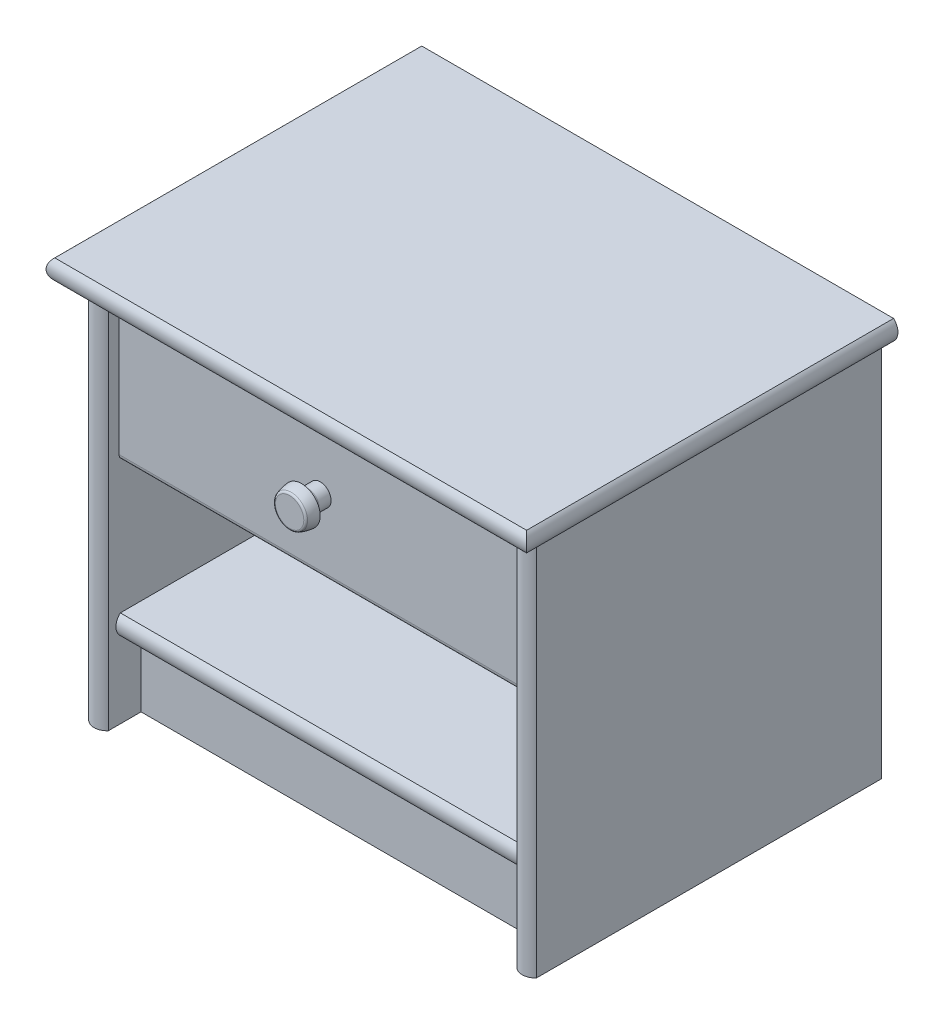
ISO-10303-21;
HEADER;
FILE_DESCRIPTION(('STEP AP214'),'2;1');
FILE_NAME('part.step','',(''),(''),'','','');
FILE_SCHEMA(('AUTOMOTIVE_DESIGN { 1 0 10303 214 1 1 1 1 }'));
ENDSEC;
DATA;
#1=APPLICATION_CONTEXT('core data for automotive mechanical design processes');
#2=APPLICATION_PROTOCOL_DEFINITION('international standard','automotive_design',2000,#1);
#3=PRODUCT_CONTEXT('',#1,'mechanical');
#4=PRODUCT('Part','Part','',(#3));
#5=PRODUCT_RELATED_PRODUCT_CATEGORY('part','',(#4));
#6=PRODUCT_DEFINITION_FORMATION('','',#4);
#7=PRODUCT_DEFINITION_CONTEXT('part definition',#1,'design');
#8=PRODUCT_DEFINITION('design','',#6,#7);
#9=PRODUCT_DEFINITION_SHAPE('','',#8);
#10=(LENGTH_UNIT() NAMED_UNIT(*) SI_UNIT(.MILLI.,.METRE.));
#11=(NAMED_UNIT(*) PLANE_ANGLE_UNIT() SI_UNIT($,.RADIAN.));
#12=(NAMED_UNIT(*) SI_UNIT($,.STERADIAN.) SOLID_ANGLE_UNIT());
#13=UNCERTAINTY_MEASURE_WITH_UNIT(LENGTH_MEASURE(1.E-05),#10,'distance_accuracy_value','');
#14=(GEOMETRIC_REPRESENTATION_CONTEXT(3) GLOBAL_UNCERTAINTY_ASSIGNED_CONTEXT((#13)) GLOBAL_UNIT_ASSIGNED_CONTEXT((#10,
#11,#12)) REPRESENTATION_CONTEXT('',''));
#15=CARTESIAN_POINT('',(0.,0.,0.));
#16=DIRECTION('',(0.,0.,1.));
#17=DIRECTION('',(1.,0.,0.));
#18=AXIS2_PLACEMENT_3D('',#15,#16,#17);
#19=CARTESIAN_POINT('',(187.,176.25,151.));
#20=DIRECTION('',(0.,0.,-1.));
#21=DIRECTION('',(-1.,0.,0.));
#22=AXIS2_PLACEMENT_3D('',#19,#20,#21);
#23=PLANE('',#22);
#24=DIRECTION('',(-1.,0.,0.));
#25=VECTOR('',#24,1.);
#26=CARTESIAN_POINT('',(509.063658303759,40.75,151.000000000003));
#27=LINE('',#26,#25);
#28=CARTESIAN_POINT('',(184.,40.75,151.));
#29=VERTEX_POINT('',#28);
#30=CARTESIAN_POINT('',(-184.,40.75,151.));
#31=VERTEX_POINT('',#30);
#32=EDGE_CURVE('E416',#29,#31,#27,.T.);
#33=ORIENTED_EDGE('',*,*,#32,.F.);
#34=DIRECTION('',(0.,1.,0.));
#35=VECTOR('',#34,1.);
#36=CARTESIAN_POINT('',(184.,27.2631670194948,151.));
#37=LINE('',#36,#35);
#38=CARTESIAN_POINT('',(184.,169.25,151.));
#39=VERTEX_POINT('',#38);
#40=EDGE_CURVE('E360',#29,#39,#37,.T.);
#41=ORIENTED_EDGE('',*,*,#40,.T.);
#42=DIRECTION('',(-1.,0.,0.));
#43=VECTOR('',#42,1.);
#44=CARTESIAN_POINT('',(509.063658303759,169.25,151.000000000003));
#45=LINE('',#44,#43);
#46=CARTESIAN_POINT('',(-184.,169.25,151.));
#47=VERTEX_POINT('',#46);
#48=EDGE_CURVE('E339',#39,#47,#45,.T.);
#49=ORIENTED_EDGE('',*,*,#48,.T.);
#50=DIRECTION('',(0.,1.,0.));
#51=VECTOR('',#50,1.);
#52=CARTESIAN_POINT('',(-184.,27.2631670194948,151.));
#53=LINE('',#52,#51);
#54=EDGE_CURVE('E337',#31,#47,#53,.T.);
#55=ORIENTED_EDGE('',*,*,#54,.F.);
#56=EDGE_LOOP('',(#33,#41,#49,#55));
#57=FACE_BOUND('',#56,.T.);
#58=CARTESIAN_POINT('',(0.,101.25,151.));
#59=DIRECTION('',(0.,0.,-1.));
#60=DIRECTION('',(-1.,0.,0.));
#61=AXIS2_PLACEMENT_3D('',#58,#59,#60);
#62=CIRCLE('',#61,9.99999999999999);
#63=CARTESIAN_POINT('',(-9.99999999999999,101.25,151.));
#64=VERTEX_POINT('',#63);
#65=EDGE_CURVE('E12',#64,#64,#62,.F.);
#66=ORIENTED_EDGE('',*,*,#65,.F.);
#67=EDGE_LOOP('',(#66));
#68=FACE_BOUND('',#67,.T.);
#69=ADVANCED_FACE('F65',(#57,#68),#23,.F.);
#70=CARTESIAN_POINT('',(-205.,176.25,-158.));
#71=DIRECTION('',(0.,0.,1.));
#72=DIRECTION('',(1.,0.,0.));
#73=AXIS2_PLACEMENT_3D('',#70,#71,#72);
#74=PLANE('',#73);
#75=DIRECTION('',(-1.,0.,0.));
#76=VECTOR('',#75,1.);
#77=CARTESIAN_POINT('',(220.,194.25,-158.));
#78=LINE('',#77,#76);
#79=CARTESIAN_POINT('',(216.,194.25,-158.));
#80=VERTEX_POINT('',#79);
#81=CARTESIAN_POINT('',(-216.,194.25,-158.));
#82=VERTEX_POINT('',#81);
#83=EDGE_CURVE('E231',#80,#82,#78,.T.);
#84=ORIENTED_EDGE('',*,*,#83,.F.);
#85=CARTESIAN_POINT('',(207.875,185.25,-158.));
#86=DIRECTION('',(0.,0.,1.));
#87=DIRECTION('',(1.,0.,0.));
#88=AXIS2_PLACEMENT_3D('',#85,#86,#87);
#89=CIRCLE('',#88,12.1249999999999);
#90=CARTESIAN_POINT('',(216.,176.25,-158.));
#91=VERTEX_POINT('',#90);
#92=EDGE_CURVE('E217',#80,#91,#89,.F.);
#93=ORIENTED_EDGE('',*,*,#92,.T.);
#94=DIRECTION('',(-1.,0.,0.));
#95=VECTOR('',#94,1.);
#96=CARTESIAN_POINT('',(220.,176.25,-158.));
#97=LINE('',#96,#95);
#98=CARTESIAN_POINT('',(205.,176.25,-158.));
#99=VERTEX_POINT('',#98);
#100=EDGE_CURVE('E250',#91,#99,#97,.T.);
#101=ORIENTED_EDGE('',*,*,#100,.T.);
#102=DIRECTION('',(0.,-1.,0.));
#103=VECTOR('',#102,1.);
#104=CARTESIAN_POINT('',(205.,176.25,-158.));
#105=LINE('',#104,#103);
#106=CARTESIAN_POINT('',(205.,-176.25,-158.));
#107=VERTEX_POINT('',#106);
#108=EDGE_CURVE('E294',#99,#107,#105,.T.);
#109=ORIENTED_EDGE('',*,*,#108,.T.);
#110=DIRECTION('',(-1.,0.,0.));
#111=VECTOR('',#110,1.);
#112=CARTESIAN_POINT('',(-205.,-176.25,-158.));
#113=LINE('',#112,#111);
#114=CARTESIAN_POINT('',(-205.,-176.25,-158.));
#115=VERTEX_POINT('',#114);
#116=EDGE_CURVE('E80',#107,#115,#113,.T.);
#117=ORIENTED_EDGE('',*,*,#116,.T.);
#118=DIRECTION('',(0.,-1.,0.));
#119=VECTOR('',#118,1.);
#120=CARTESIAN_POINT('',(-205.,176.25,-158.));
#121=LINE('',#120,#119);
#122=CARTESIAN_POINT('',(-205.,176.25,-158.));
#123=VERTEX_POINT('',#122);
#124=EDGE_CURVE('E502',#123,#115,#121,.T.);
#125=ORIENTED_EDGE('',*,*,#124,.F.);
#126=CARTESIAN_POINT('',(-216.,176.25,-158.));
#127=VERTEX_POINT('',#126);
#128=EDGE_CURVE('E248',#123,#127,#97,.T.);
#129=ORIENTED_EDGE('',*,*,#128,.T.);
#130=CARTESIAN_POINT('',(-207.875,185.25,-158.));
#131=DIRECTION('',(0.,0.,1.));
#132=DIRECTION('',(1.,0.,0.));
#133=AXIS2_PLACEMENT_3D('',#130,#131,#132);
#134=CIRCLE('',#133,12.1249999999999);
#135=EDGE_CURVE('E237',#82,#127,#134,.T.);
#136=ORIENTED_EDGE('',*,*,#135,.F.);
#137=EDGE_LOOP('',(#84,#93,#101,#109,#117,#125,#129,#136));
#138=FACE_BOUND('',#137,.T.);
#139=ADVANCED_FACE('F235',(#138),#74,.F.);
#140=CARTESIAN_POINT('',(220.,185.25,169.875));
#141=DIRECTION('',(-1.,0.,0.));
#142=DIRECTION('',(0.,0.,1.));
#143=AXIS2_PLACEMENT_3D('',#140,#141,#142);
#144=CYLINDRICAL_SURFACE('',#143,12.1249999999999);
#145=CARTESIAN_POINT('',(207.875,185.25,169.875));
#146=DIRECTION('',(-0.707106781186547,0.,0.707106781186547));
#147=DIRECTION('',(-0.707106781186547,0.,-0.707106781186547));
#148=AXIS2_PLACEMENT_3D('',#145,#146,#147);
#149=ELLIPSE('',#148,17.1473394437737,12.1249999999999);
#150=CARTESIAN_POINT('',(216.,176.25,178.));
#151=VERTEX_POINT('',#150);
#152=CARTESIAN_POINT('',(216.,194.25,178.));
#153=VERTEX_POINT('',#152);
#154=EDGE_CURVE('E226',#151,#153,#149,.T.);
#155=ORIENTED_EDGE('',*,*,#154,.T.);
#156=DIRECTION('',(-1.,0.,0.));
#157=VECTOR('',#156,1.);
#158=CARTESIAN_POINT('',(220.,194.25,178.));
#159=LINE('',#158,#157);
#160=CARTESIAN_POINT('',(-216.,194.25,178.));
#161=VERTEX_POINT('',#160);
#162=EDGE_CURVE('E233',#153,#161,#159,.T.);
#163=ORIENTED_EDGE('',*,*,#162,.T.);
#164=CARTESIAN_POINT('',(-207.875,185.25,169.875));
#165=DIRECTION('',(-0.707106781186547,0.,-0.707106781186547));
#166=DIRECTION('',(-0.707106781186547,0.,0.707106781186547));
#167=AXIS2_PLACEMENT_3D('',#164,#165,#166);
#168=ELLIPSE('',#167,17.1473394437737,12.1249999999999);
#169=CARTESIAN_POINT('',(-216.,176.25,178.));
#170=VERTEX_POINT('',#169);
#171=EDGE_CURVE('E523',#170,#161,#168,.T.);
#172=ORIENTED_EDGE('',*,*,#171,.F.);
#173=DIRECTION('',(-1.,0.,0.));
#174=VECTOR('',#173,1.);
#175=CARTESIAN_POINT('',(220.,176.25,178.));
#176=LINE('',#175,#174);
#177=EDGE_CURVE('E244',#151,#170,#176,.T.);
#178=ORIENTED_EDGE('',*,*,#177,.F.);
#179=EDGE_LOOP('',(#155,#163,#172,#178));
#180=FACE_BOUND('',#179,.T.);
#181=ADVANCED_FACE('F488',(#180),#144,.T.);
#182=CARTESIAN_POINT('',(220.,194.25,-158.));
#183=DIRECTION('',(0.,-1.,0.));
#184=DIRECTION('',(0.,0.,-1.));
#185=AXIS2_PLACEMENT_3D('',#182,#183,#184);
#186=PLANE('',#185);
#187=ORIENTED_EDGE('',*,*,#162,.F.);
#188=DIRECTION('',(0.,0.,1.));
#189=VECTOR('',#188,1.);
#190=CARTESIAN_POINT('',(216.,194.25,-158.00005));
#191=LINE('',#190,#189);
#192=EDGE_CURVE('E73',#153,#80,#191,.F.);
#193=ORIENTED_EDGE('',*,*,#192,.T.);
#194=ORIENTED_EDGE('',*,*,#83,.T.);
#195=DIRECTION('',(0.,0.,1.));
#196=VECTOR('',#195,1.);
#197=CARTESIAN_POINT('',(-216.,194.25,-158.00005));
#198=LINE('',#197,#196);
#199=EDGE_CURVE('E225',#82,#161,#198,.T.);
#200=ORIENTED_EDGE('',*,*,#199,.T.);
#201=EDGE_LOOP('',(#187,#193,#194,#200));
#202=FACE_BOUND('',#201,.T.);
#203=ADVANCED_FACE('F229',(#202),#186,.F.);
#204=CARTESIAN_POINT('',(220.,176.25,-158.));
#205=DIRECTION('',(0.,1.,0.));
#206=DIRECTION('',(0.,0.,1.));
#207=AXIS2_PLACEMENT_3D('',#204,#205,#206);
#208=PLANE('',#207);
#209=ORIENTED_EDGE('',*,*,#100,.F.);
#210=DIRECTION('',(0.,0.,1.));
#211=VECTOR('',#210,1.);
#212=CARTESIAN_POINT('',(216.,176.25,-158.00005));
#213=LINE('',#212,#211);
#214=EDGE_CURVE('E222',#91,#151,#213,.T.);
#215=ORIENTED_EDGE('',*,*,#214,.T.);
#216=ORIENTED_EDGE('',*,*,#177,.T.);
#217=DIRECTION('',(0.,0.,1.));
#218=VECTOR('',#217,1.);
#219=CARTESIAN_POINT('',(-216.,176.25,-158.00005));
#220=LINE('',#219,#218);
#221=EDGE_CURVE('E525',#127,#170,#220,.T.);
#222=ORIENTED_EDGE('',*,*,#221,.F.);
#223=ORIENTED_EDGE('',*,*,#128,.F.);
#224=DIRECTION('',(0.,0.,1.));
#225=VECTOR('',#224,1.);
#226=CARTESIAN_POINT('',(-205.,176.25,158.));
#227=LINE('',#226,#225);
#228=CARTESIAN_POINT('',(-205.,176.25,158.));
#229=VERTEX_POINT('',#228);
#230=EDGE_CURVE('E258',#123,#229,#227,.T.);
#231=ORIENTED_EDGE('',*,*,#230,.T.);
#232=CARTESIAN_POINT('',(-196.,176.25,149.875));
#233=DIRECTION('',(0.,1.,0.));
#234=DIRECTION('',(0.,0.,1.));
#235=AXIS2_PLACEMENT_3D('',#232,#233,#234);
#236=CIRCLE('',#235,12.125);
#237=CARTESIAN_POINT('',(-187.,176.25,158.));
#238=VERTEX_POINT('',#237);
#239=EDGE_CURVE('E261',#229,#238,#236,.T.);
#240=ORIENTED_EDGE('',*,*,#239,.T.);
#241=DIRECTION('',(0.,0.,-1.));
#242=VECTOR('',#241,1.);
#243=CARTESIAN_POINT('',(-187.,176.25,151.));
#244=LINE('',#243,#242);
#245=CARTESIAN_POINT('',(-187.,176.25,142.));
#246=VERTEX_POINT('',#245);
#247=EDGE_CURVE('E270',#238,#246,#244,.T.);
#248=ORIENTED_EDGE('',*,*,#247,.T.);
#249=CARTESIAN_POINT('',(-172.,176.25,142.));
#250=DIRECTION('',(0.,-1.,0.));
#251=DIRECTION('',(0.,0.,1.));
#252=AXIS2_PLACEMENT_3D('',#249,#250,#251);
#253=CIRCLE('',#252,14.9999999999999);
#254=CARTESIAN_POINT('',(-185.747727084868,176.25,147.999999999998));
#255=VERTEX_POINT('',#254);
#256=EDGE_CURVE('E359',#255,#246,#253,.T.);
#257=ORIENTED_EDGE('',*,*,#256,.F.);
#258=DIRECTION('',(-1.,0.,0.));
#259=VECTOR('',#258,1.);
#260=CARTESIAN_POINT('',(509.063658303759,176.25,148.000000000001));
#261=LINE('',#260,#259);
#262=CARTESIAN_POINT('',(185.747727084867,176.25,148.));
#263=VERTEX_POINT('',#262);
#264=EDGE_CURVE('E336',#263,#255,#261,.T.);
#265=ORIENTED_EDGE('',*,*,#264,.F.);
#266=CARTESIAN_POINT('',(172.,176.25,142.));
#267=DIRECTION('',(0.,-1.,0.));
#268=DIRECTION('',(0.,0.,1.));
#269=AXIS2_PLACEMENT_3D('',#266,#267,#268);
#270=CIRCLE('',#269,15.0000000000001);
#271=CARTESIAN_POINT('',(187.,176.25,142.));
#272=VERTEX_POINT('',#271);
#273=EDGE_CURVE('E239',#272,#263,#270,.T.);
#274=ORIENTED_EDGE('',*,*,#273,.F.);
#275=DIRECTION('',(0.,0.,1.));
#276=VECTOR('',#275,1.);
#277=CARTESIAN_POINT('',(187.,176.25,158.));
#278=LINE('',#277,#276);
#279=CARTESIAN_POINT('',(187.,176.25,158.));
#280=VERTEX_POINT('',#279);
#281=EDGE_CURVE('E272',#272,#280,#278,.T.);
#282=ORIENTED_EDGE('',*,*,#281,.T.);
#283=CARTESIAN_POINT('',(196.,176.25,149.875));
#284=DIRECTION('',(0.,1.,0.));
#285=DIRECTION('',(0.,0.,1.));
#286=AXIS2_PLACEMENT_3D('',#283,#284,#285);
#287=CIRCLE('',#286,12.125);
#288=CARTESIAN_POINT('',(205.,176.25,158.));
#289=VERTEX_POINT('',#288);
#290=EDGE_CURVE('E274',#280,#289,#287,.T.);
#291=ORIENTED_EDGE('',*,*,#290,.T.);
#292=DIRECTION('',(0.,0.,-1.));
#293=VECTOR('',#292,1.);
#294=CARTESIAN_POINT('',(205.,176.25,-158.));
#295=LINE('',#294,#293);
#296=EDGE_CURVE('E276',#289,#99,#295,.T.);
#297=ORIENTED_EDGE('',*,*,#296,.T.);
#298=EDGE_LOOP('',(#209,#215,#216,#222,#223,#231,#240,#248,#257,#265,#274,#282,#291,#297));
#299=FACE_BOUND('',#298,.T.);
#300=ADVANCED_FACE('F458',(#299),#208,.F.);
#301=CARTESIAN_POINT('',(196.,-176.25,149.875));
#302=DIRECTION('',(0.,1.,0.));
#303=DIRECTION('',(0.,0.,1.));
#304=AXIS2_PLACEMENT_3D('',#301,#302,#303);
#305=PLANE('',#304);
#306=DIRECTION('',(-1.,0.,0.));
#307=VECTOR('',#306,1.);
#308=CARTESIAN_POINT('',(509.063658303759,-176.25,128.000000000001));
#309=LINE('',#308,#307);
#310=CARTESIAN_POINT('',(187.,-176.25,128.));
#311=VERTEX_POINT('',#310);
#312=CARTESIAN_POINT('',(-187.,-176.25,127.999999999998));
#313=VERTEX_POINT('',#312);
#314=EDGE_CURVE('E388',#311,#313,#309,.T.);
#315=ORIENTED_EDGE('',*,*,#314,.T.);
#316=DIRECTION('',(0.,0.,-1.));
#317=VECTOR('',#316,1.);
#318=CARTESIAN_POINT('',(-187.,-176.25,151.));
#319=LINE('',#318,#317);
#320=CARTESIAN_POINT('',(-187.,-176.25,158.));
#321=VERTEX_POINT('',#320);
#322=EDGE_CURVE('E283',#321,#313,#319,.T.);
#323=ORIENTED_EDGE('',*,*,#322,.F.);
#324=CARTESIAN_POINT('',(-196.,-176.25,149.875));
#325=DIRECTION('',(0.,1.,0.));
#326=DIRECTION('',(0.,0.,1.));
#327=AXIS2_PLACEMENT_3D('',#324,#325,#326);
#328=CIRCLE('',#327,12.125);
#329=CARTESIAN_POINT('',(-205.,-176.25,158.));
#330=VERTEX_POINT('',#329);
#331=EDGE_CURVE('E280',#330,#321,#328,.T.);
#332=ORIENTED_EDGE('',*,*,#331,.F.);
#333=DIRECTION('',(0.,0.,1.));
#334=VECTOR('',#333,1.);
#335=CARTESIAN_POINT('',(-205.,-176.25,158.));
#336=LINE('',#335,#334);
#337=EDGE_CURVE('E277',#115,#330,#336,.T.);
#338=ORIENTED_EDGE('',*,*,#337,.F.);
#339=ORIENTED_EDGE('',*,*,#116,.F.);
#340=DIRECTION('',(0.,0.,-1.));
#341=VECTOR('',#340,1.);
#342=CARTESIAN_POINT('',(205.,-176.25,-158.));
#343=LINE('',#342,#341);
#344=CARTESIAN_POINT('',(205.,-176.25,158.));
#345=VERTEX_POINT('',#344);
#346=EDGE_CURVE('E88',#345,#107,#343,.T.);
#347=ORIENTED_EDGE('',*,*,#346,.F.);
#348=CARTESIAN_POINT('',(196.,-176.25,149.875));
#349=DIRECTION('',(0.,1.,0.));
#350=DIRECTION('',(0.,0.,1.));
#351=AXIS2_PLACEMENT_3D('',#348,#349,#350);
#352=CIRCLE('',#351,12.125);
#353=CARTESIAN_POINT('',(187.,-176.25,158.));
#354=VERTEX_POINT('',#353);
#355=EDGE_CURVE('E287',#354,#345,#352,.T.);
#356=ORIENTED_EDGE('',*,*,#355,.F.);
#357=DIRECTION('',(0.,0.,1.));
#358=VECTOR('',#357,1.);
#359=CARTESIAN_POINT('',(187.,-176.25,158.));
#360=LINE('',#359,#358);
#361=EDGE_CURVE('E285',#311,#354,#360,.T.);
#362=ORIENTED_EDGE('',*,*,#361,.F.);
#363=EDGE_LOOP('',(#315,#323,#332,#338,#339,#347,#356,#362));
#364=FACE_BOUND('',#363,.T.);
#365=ADVANCED_FACE('F465',(#364),#305,.F.);
#366=CARTESIAN_POINT('',(-205.,176.25,158.));
#367=DIRECTION('',(1.,0.,0.));
#368=DIRECTION('',(0.,0.,-1.));
#369=AXIS2_PLACEMENT_3D('',#366,#367,#368);
#370=PLANE('',#369);
#371=ORIENTED_EDGE('',*,*,#337,.T.);
#372=DIRECTION('',(0.,-1.,0.));
#373=VECTOR('',#372,1.);
#374=CARTESIAN_POINT('',(-205.,176.25,158.));
#375=LINE('',#374,#373);
#376=EDGE_CURVE('E300',#229,#330,#375,.T.);
#377=ORIENTED_EDGE('',*,*,#376,.F.);
#378=ORIENTED_EDGE('',*,*,#230,.F.);
#379=ORIENTED_EDGE('',*,*,#124,.T.);
#380=EDGE_LOOP('',(#371,#377,#378,#379));
#381=FACE_BOUND('',#380,.T.);
#382=ADVANCED_FACE('F67',(#381),#370,.F.);
#383=CARTESIAN_POINT('',(-196.,176.25,149.875));
#384=DIRECTION('',(0.,-1.,0.));
#385=DIRECTION('',(0.,0.,-1.));
#386=AXIS2_PLACEMENT_3D('',#383,#384,#385);
#387=CYLINDRICAL_SURFACE('',#386,12.125);
#388=ORIENTED_EDGE('',*,*,#331,.T.);
#389=DIRECTION('',(0.,-1.,0.));
#390=VECTOR('',#389,1.);
#391=CARTESIAN_POINT('',(-187.,176.25,158.));
#392=LINE('',#391,#390);
#393=EDGE_CURVE('E297',#238,#321,#392,.T.);
#394=ORIENTED_EDGE('',*,*,#393,.F.);
#395=ORIENTED_EDGE('',*,*,#239,.F.);
#396=ORIENTED_EDGE('',*,*,#376,.T.);
#397=EDGE_LOOP('',(#388,#394,#395,#396));
#398=FACE_BOUND('',#397,.T.);
#399=ADVANCED_FACE('F494',(#398),#387,.T.);
#400=CARTESIAN_POINT('',(-187.,176.25,151.));
#401=DIRECTION('',(-1.,0.,0.));
#402=DIRECTION('',(0.,0.,1.));
#403=AXIS2_PLACEMENT_3D('',#400,#401,#402);
#404=PLANE('',#403);
#405=DIRECTION('',(0.,1.,0.));
#406=VECTOR('',#405,1.);
#407=CARTESIAN_POINT('',(-187.,27.2631670194948,142.));
#408=LINE('',#407,#406);
#409=CARTESIAN_POINT('',(-187.,36.75,142.));
#410=VERTEX_POINT('',#409);
#411=EDGE_CURVE('E366',#410,#246,#408,.T.);
#412=ORIENTED_EDGE('',*,*,#411,.T.);
#413=ORIENTED_EDGE('',*,*,#247,.F.);
#414=ORIENTED_EDGE('',*,*,#393,.T.);
#415=ORIENTED_EDGE('',*,*,#322,.T.);
#416=DIRECTION('',(0.,1.,0.));
#417=VECTOR('',#416,1.);
#418=CARTESIAN_POINT('',(-187.,-36.5520289731682,127.999999999999));
#419=LINE('',#418,#417);
#420=CARTESIAN_POINT('',(-187.,-106.25,127.999999999998));
#421=VERTEX_POINT('',#420);
#422=EDGE_CURVE('E391',#313,#421,#419,.T.);
#423=ORIENTED_EDGE('',*,*,#422,.T.);
#424=DIRECTION('',(0.,0.,-1.));
#425=VECTOR('',#424,1.);
#426=CARTESIAN_POINT('',(-186.999999999998,-106.25,-354.954294671214));
#427=LINE('',#426,#425);
#428=CARTESIAN_POINT('',(-187.,-106.25,146.999999999998));
#429=VERTEX_POINT('',#428);
#430=EDGE_CURVE('E397',#429,#421,#427,.T.);
#431=ORIENTED_EDGE('',*,*,#430,.F.);
#432=CARTESIAN_POINT('',(-187.,-97.25,138.874999999998));
#433=DIRECTION('',(1.,0.,0.));
#434=DIRECTION('',(0.,0.,-1.));
#435=AXIS2_PLACEMENT_3D('',#432,#433,#434);
#436=CIRCLE('',#435,12.125);
#437=CARTESIAN_POINT('',(-187.,-88.25,146.999999999998));
#438=VERTEX_POINT('',#437);
#439=EDGE_CURVE('E413',#429,#438,#436,.F.);
#440=ORIENTED_EDGE('',*,*,#439,.T.);
#441=DIRECTION('',(0.,0.,-1.));
#442=VECTOR('',#441,1.);
#443=CARTESIAN_POINT('',(-186.999999999998,-88.25,-354.954294671214));
#444=LINE('',#443,#442);
#445=CARTESIAN_POINT('',(-186.999999999999,-88.25,-140.000000000002));
#446=VERTEX_POINT('',#445);
#447=EDGE_CURVE('E409',#438,#446,#444,.T.);
#448=ORIENTED_EDGE('',*,*,#447,.T.);
#449=DIRECTION('',(0.,1.,0.));
#450=VECTOR('',#449,1.);
#451=CARTESIAN_POINT('',(-186.999999999999,-36.552028973168,-140.000000000002));
#452=LINE('',#451,#450);
#453=CARTESIAN_POINT('',(-186.999999999999,36.75,-140.000000000002));
#454=VERTEX_POINT('',#453);
#455=EDGE_CURVE('E404',#446,#454,#452,.T.);
#456=ORIENTED_EDGE('',*,*,#455,.T.);
#457=DIRECTION('',(0.,0.,1.));
#458=VECTOR('',#457,1.);
#459=CARTESIAN_POINT('',(-186.999999999998,36.75,-354.954294671214));
#460=LINE('',#459,#458);
#461=EDGE_CURVE('E417',#454,#410,#460,.T.);
#462=ORIENTED_EDGE('',*,*,#461,.T.);
#463=EDGE_LOOP('',(#412,#413,#414,#415,#423,#431,#440,#448,#456,#462));
#464=FACE_BOUND('',#463,.T.);
#465=ADVANCED_FACE('F439',(#464),#404,.F.);
#466=CARTESIAN_POINT('',(187.,176.25,158.));
#467=DIRECTION('',(1.,0.,0.));
#468=DIRECTION('',(0.,0.,-1.));
#469=AXIS2_PLACEMENT_3D('',#466,#467,#468);
#470=PLANE('',#469);
#471=DIRECTION('',(0.,-1.,0.));
#472=VECTOR('',#471,1.);
#473=CARTESIAN_POINT('',(187.,176.25,158.));
#474=LINE('',#473,#472);
#475=EDGE_CURVE('E293',#280,#354,#474,.T.);
#476=ORIENTED_EDGE('',*,*,#475,.F.);
#477=ORIENTED_EDGE('',*,*,#281,.F.);
#478=DIRECTION('',(0.,1.,0.));
#479=VECTOR('',#478,1.);
#480=CARTESIAN_POINT('',(187.,27.2631670194948,142.));
#481=LINE('',#480,#479);
#482=CARTESIAN_POINT('',(187.,36.75,142.));
#483=VERTEX_POINT('',#482);
#484=EDGE_CURVE('E242',#483,#272,#481,.T.);
#485=ORIENTED_EDGE('',*,*,#484,.F.);
#486=DIRECTION('',(0.,0.,1.));
#487=VECTOR('',#486,1.);
#488=CARTESIAN_POINT('',(187.,36.75,-354.954294671211));
#489=LINE('',#488,#487);
#490=CARTESIAN_POINT('',(187.,36.75,-140.));
#491=VERTEX_POINT('',#490);
#492=EDGE_CURVE('E425',#491,#483,#489,.T.);
#493=ORIENTED_EDGE('',*,*,#492,.F.);
#494=DIRECTION('',(0.,1.,0.));
#495=VECTOR('',#494,1.);
#496=CARTESIAN_POINT('',(187.,-36.552028973168,-140.));
#497=LINE('',#496,#495);
#498=CARTESIAN_POINT('',(187.,-88.25,-140.));
#499=VERTEX_POINT('',#498);
#500=EDGE_CURVE('E407',#499,#491,#497,.T.);
#501=ORIENTED_EDGE('',*,*,#500,.F.);
#502=DIRECTION('',(0.,0.,-1.));
#503=VECTOR('',#502,1.);
#504=CARTESIAN_POINT('',(187.,-88.25,-354.954294671211));
#505=LINE('',#504,#503);
#506=CARTESIAN_POINT('',(187.,-88.25,147.));
#507=VERTEX_POINT('',#506);
#508=EDGE_CURVE('E281',#507,#499,#505,.T.);
#509=ORIENTED_EDGE('',*,*,#508,.F.);
#510=CARTESIAN_POINT('',(187.,-97.25,138.875));
#511=DIRECTION('',(1.,0.,0.));
#512=DIRECTION('',(0.,0.,-1.));
#513=AXIS2_PLACEMENT_3D('',#510,#511,#512);
#514=CIRCLE('',#513,12.125);
#515=CARTESIAN_POINT('',(187.,-106.25,147.));
#516=VERTEX_POINT('',#515);
#517=EDGE_CURVE('E422',#516,#507,#514,.F.);
#518=ORIENTED_EDGE('',*,*,#517,.F.);
#519=DIRECTION('',(0.,0.,-1.));
#520=VECTOR('',#519,1.);
#521=CARTESIAN_POINT('',(187.,-106.25,-354.954294671211));
#522=LINE('',#521,#520);
#523=CARTESIAN_POINT('',(187.,-106.25,128.));
#524=VERTEX_POINT('',#523);
#525=EDGE_CURVE('E383',#516,#524,#522,.T.);
#526=ORIENTED_EDGE('',*,*,#525,.T.);
#527=DIRECTION('',(0.,1.,0.));
#528=VECTOR('',#527,1.);
#529=CARTESIAN_POINT('',(187.,-36.5520289731682,128.));
#530=LINE('',#529,#528);
#531=EDGE_CURVE('E394',#311,#524,#530,.T.);
#532=ORIENTED_EDGE('',*,*,#531,.F.);
#533=ORIENTED_EDGE('',*,*,#361,.T.);
#534=EDGE_LOOP('',(#476,#477,#485,#493,#501,#509,#518,#526,#532,#533));
#535=FACE_BOUND('',#534,.T.);
#536=ADVANCED_FACE('F449',(#535),#470,.F.);
#537=CARTESIAN_POINT('',(196.,176.25,149.875));
#538=DIRECTION('',(0.,-1.,0.));
#539=DIRECTION('',(0.,0.,-1.));
#540=AXIS2_PLACEMENT_3D('',#537,#538,#539);
#541=CYLINDRICAL_SURFACE('',#540,12.125);
#542=ORIENTED_EDGE('',*,*,#355,.T.);
#543=DIRECTION('',(0.,-1.,0.));
#544=VECTOR('',#543,1.);
#545=CARTESIAN_POINT('',(205.,176.25,158.));
#546=LINE('',#545,#544);
#547=EDGE_CURVE('E291',#289,#345,#546,.T.);
#548=ORIENTED_EDGE('',*,*,#547,.F.);
#549=ORIENTED_EDGE('',*,*,#290,.F.);
#550=ORIENTED_EDGE('',*,*,#475,.T.);
#551=EDGE_LOOP('',(#542,#548,#549,#550));
#552=FACE_BOUND('',#551,.T.);
#553=ADVANCED_FACE('F505',(#552),#541,.T.);
#554=CARTESIAN_POINT('',(205.,176.25,-158.));
#555=DIRECTION('',(-1.,0.,0.));
#556=DIRECTION('',(0.,0.,1.));
#557=AXIS2_PLACEMENT_3D('',#554,#555,#556);
#558=PLANE('',#557);
#559=ORIENTED_EDGE('',*,*,#346,.T.);
#560=ORIENTED_EDGE('',*,*,#108,.F.);
#561=ORIENTED_EDGE('',*,*,#296,.F.);
#562=ORIENTED_EDGE('',*,*,#547,.T.);
#563=EDGE_LOOP('',(#559,#560,#561,#562));
#564=FACE_BOUND('',#563,.T.);
#565=ADVANCED_FACE('F508',(#564),#558,.F.);
#566=CARTESIAN_POINT('',(509.063658303761,36.75,-354.954294671211));
#567=DIRECTION('',(0.,-1.,0.));
#568=DIRECTION('',(0.,0.,-1.));
#569=AXIS2_PLACEMENT_3D('',#566,#567,#568);
#570=PLANE('',#569);
#571=CARTESIAN_POINT('',(172.,36.75,142.));
#572=DIRECTION('',(0.,-1.,0.));
#573=DIRECTION('',(0.,0.,-1.));
#574=AXIS2_PLACEMENT_3D('',#571,#572,#573);
#575=CIRCLE('',#574,15.0000000000001);
#576=CARTESIAN_POINT('',(185.266499161422,36.75,149.));
#577=VERTEX_POINT('',#576);
#578=EDGE_CURVE('E453',#483,#577,#575,.T.);
#579=ORIENTED_EDGE('',*,*,#578,.T.);
#580=DIRECTION('',(-1.,0.,0.));
#581=VECTOR('',#580,1.);
#582=CARTESIAN_POINT('',(509.063658303759,36.75,149.000000000001));
#583=LINE('',#582,#581);
#584=CARTESIAN_POINT('',(-185.266499161422,36.75,148.999999999998));
#585=VERTEX_POINT('',#584);
#586=EDGE_CURVE('E419',#577,#585,#583,.T.);
#587=ORIENTED_EDGE('',*,*,#586,.T.);
#588=CARTESIAN_POINT('',(-172.,36.75,142.));
#589=DIRECTION('',(0.,-1.,0.));
#590=DIRECTION('',(0.,0.,-1.));
#591=AXIS2_PLACEMENT_3D('',#588,#589,#590);
#592=CIRCLE('',#591,14.9999999999999);
#593=EDGE_CURVE('E364',#585,#410,#592,.T.);
#594=ORIENTED_EDGE('',*,*,#593,.T.);
#595=ORIENTED_EDGE('',*,*,#461,.F.);
#596=DIRECTION('',(-1.,0.,0.));
#597=VECTOR('',#596,1.);
#598=CARTESIAN_POINT('',(509.06365830376,36.75,-139.999999999999));
#599=LINE('',#598,#597);
#600=EDGE_CURVE('E267',#491,#454,#599,.T.);
#601=ORIENTED_EDGE('',*,*,#600,.F.);
#602=ORIENTED_EDGE('',*,*,#492,.T.);
#603=EDGE_LOOP('',(#579,#587,#594,#595,#601,#602));
#604=FACE_BOUND('',#603,.T.);
#605=ADVANCED_FACE('F347',(#604),#570,.T.);
#606=CARTESIAN_POINT('',(509.063658303759,40.75,146.000000000001));
#607=DIRECTION('',(-1.,0.,0.));
#608=DIRECTION('',(0.,0.,1.));
#609=AXIS2_PLACEMENT_3D('',#606,#607,#608);
#610=CYLINDRICAL_SURFACE('',#609,4.99999999999995);
#611=CARTESIAN_POINT('',(187.,43.7499999999998,142.));
#612=CARTESIAN_POINT('',(187.000000409348,43.8598013658818,142.082331478785));
#613=CARTESIAN_POINT('',(186.999322431285,43.9661971361691,142.169210135985));
#614=CARTESIAN_POINT('',(186.996159876405,44.171484460972,142.351405998428));
#615=CARTESIAN_POINT('',(186.993675164217,44.2703754525703,142.446723835516));
#616=CARTESIAN_POINT('',(186.986449811256,44.4599270290942,142.645112441715));
#617=CARTESIAN_POINT('',(186.981709563284,44.5505890438193,142.748181858263));
#618=CARTESIAN_POINT('',(186.969544090469,44.7230627654884,142.96132233075));
#619=CARTESIAN_POINT('',(186.96211900457,44.8048749301375,143.071393024123));
#620=CARTESIAN_POINT('',(186.944180737534,44.9591672687926,143.297833800059));
#621=CARTESIAN_POINT('',(186.9336641736,45.0316370944826,143.414210668661));
#622=CARTESIAN_POINT('',(186.909200574952,45.1666719322569,143.652289551522));
#623=CARTESIAN_POINT('',(186.895252282176,45.2292332980687,143.773993505194));
#624=CARTESIAN_POINT('',(186.86367164204,45.3439620556181,144.021589044811));
#625=CARTESIAN_POINT('',(186.846043146319,45.3961402036169,144.14747613784));
#626=CARTESIAN_POINT('',(186.806896571953,45.4899135481841,144.402597055592));
#627=CARTESIAN_POINT('',(186.7853770756,45.5315048740411,144.531832085402));
#628=CARTESIAN_POINT('',(186.738689142972,45.603392873298,144.790715939239));
#629=CARTESIAN_POINT('',(186.713577030675,45.6338419473411,144.920332665444));
#630=CARTESIAN_POINT('',(186.659466610282,45.6842258137731,145.18083994879));
#631=CARTESIAN_POINT('',(186.630466906837,45.7041568182366,145.311730947583));
#632=CARTESIAN_POINT('',(186.568671038014,45.7335455054058,145.573785974032));
#633=CARTESIAN_POINT('',(186.535874926974,45.7430033379921,145.704949997754));
#634=CARTESIAN_POINT('',(186.466638986024,45.7516044645837,145.966698243196));
#635=CARTESIAN_POINT('',(186.430197775173,45.7507438346683,146.09728222545));
#636=CARTESIAN_POINT('',(186.352963441436,45.7387849784809,146.360237576385));
#637=CARTESIAN_POINT('',(186.312084396059,45.7274317511418,146.492572201029));
#638=CARTESIAN_POINT('',(186.227081211393,45.6944518786685,146.754915374655));
#639=CARTESIAN_POINT('',(186.182955902921,45.672821516631,146.884923064395));
#640=CARTESIAN_POINT('',(186.046294375633,45.5930519396552,147.270259171234));
#641=CARTESIAN_POINT('',(185.94940944224,45.5200235734106,147.521114052925));
#642=CARTESIAN_POINT('',(185.73930399242,45.3297641931167,148.025991920861));
#643=CARTESIAN_POINT('',(185.625394902869,45.2093327820853,148.278507743611));
#644=CARTESIAN_POINT('',(185.393565573672,44.9291762203866,148.758968044383));
#645=CARTESIAN_POINT('',(185.27564162357,44.769413821924,148.98688893414));
#646=CARTESIAN_POINT('',(185.03190575849,44.3983385270944,149.432312977853));
#647=CARTESIAN_POINT('',(184.906290132583,44.1837690734475,149.647224551278));
#648=CARTESIAN_POINT('',(184.667084791053,43.7153693074577,150.037242131037));
#649=CARTESIAN_POINT('',(184.553483839597,43.4615762328119,150.212385506653));
#650=CARTESIAN_POINT('',(184.372199287395,42.9788268942128,150.482280631887));
#651=CARTESIAN_POINT('',(184.299917405926,42.7567988332484,150.58624547958));
#652=CARTESIAN_POINT('',(184.206670543527,42.4106077580662,150.717802005004));
#653=CARTESIAN_POINT('',(184.178116790964,42.293014546472,150.757590097765));
#654=CARTESIAN_POINT('',(184.126768927987,42.0540550694856,150.828555875417));
#655=CARTESIAN_POINT('',(184.103972306504,41.9326904750767,150.859737314797));
#656=CARTESIAN_POINT('',(184.06463883293,41.6860787455033,150.913226301176));
#657=CARTESIAN_POINT('',(184.04814831756,41.560809920191,150.935468219979));
#658=CARTESIAN_POINT('',(184.02218021063,41.3082171709251,150.970376762851));
#659=CARTESIAN_POINT('',(184.01270257845,41.1808932588793,150.983043442383));
#660=CARTESIAN_POINT('',(184.001081647598,40.9253530233246,150.998562913669));
#661=CARTESIAN_POINT('',(183.998936018497,40.7971369963545,151.001418823715));
#662=CARTESIAN_POINT('',(184.002046923678,40.540963162346,150.997270512469));
#663=CARTESIAN_POINT('',(184.007302862227,40.4130053353557,150.99026708473));
#664=CARTESIAN_POINT('',(184.024055013856,40.1725694596774,150.967846468411));
#665=CARTESIAN_POINT('',(184.034797996609,40.0599424348436,150.953443846034));
#666=CARTESIAN_POINT('',(184.061709106735,39.8365442138093,150.917156183562));
#667=CARTESIAN_POINT('',(184.077879027522,39.7257736438243,150.895268669927));
#668=CARTESIAN_POINT('',(184.133956984465,39.3973645454721,150.818795279121));
#669=CARTESIAN_POINT('',(184.181448284291,39.1834274127001,150.753379150492));
#670=CARTESIAN_POINT('',(184.295366347735,38.7596885678315,150.592673975109));
#671=CARTESIAN_POINT('',(184.362619217104,38.5506249855049,150.496058011788));
#672=CARTESIAN_POINT('',(184.510024592843,38.1509352329072,150.27748037538));
#673=CARTESIAN_POINT('',(184.590193525844,37.9603330427405,150.155486368225));
#674=CARTESIAN_POINT('',(184.766886664018,37.5822679743598,149.876316309242));
#675=CARTESIAN_POINT('',(184.864241819986,37.3968502810134,149.716890878194));
#676=CARTESIAN_POINT('',(185.013533739371,37.1388755184434,149.460411179048));
#677=CARTESIAN_POINT('',(185.063769040342,37.0563430585851,149.372161947385));
#678=CARTESIAN_POINT('',(185.164823695563,36.8980579127788,149.190149788516));
#679=CARTESIAN_POINT('',(185.215642859649,36.8223030862626,149.096388617748));
#680=CARTESIAN_POINT('',(185.266499161422,36.75,149.));
#681=B_SPLINE_CURVE_WITH_KNOTS('',3,(#611,#612,#613,#614,#615,#616,#617,#618,#619,#620,#621,
#622,#623,#624,#625,#626,#627,#628,#629,#630,#631,#632,#633,#634,#635,#636,#637,#638,#639,#640,
#641,#642,#643,#644,#645,#646,#647,#648,#649,#650,#651,#652,#653,#654,#655,#656,#657,#658,#659,
#660,#661,#662,#663,#664,#665,#666,#667,#668,#669,#670,#671,#672,#673,#674,#675,#676,#677,#678,
#679,#680),.UNSPECIFIED.,.F.,.F.,(4,2,2,2,2,2,2,2,2,2,2,2,2,2,2,2,2,2,2,2,2,2,2,2,2,2,2,2,2,2,2,
2,2,2,4),(0.,0.411607358634805,0.823245560607386,1.23481210223552,1.64635734788051,
2.05835460681649,2.47050312853335,2.88222244579314,3.29409207869178,3.70009674580996,
4.10624752982435,4.51239250137844,4.91869192726566,5.3351328592616,5.75172451909618,
6.58424672643837,7.48677023001004,8.39015176468111,9.37140513671251,10.3517325955354,
11.1151650721285,11.496910144802,11.8784884242228,12.2628189672734,12.6471472841968,
13.0313534334855,13.4155286607485,13.7572782876324,14.0991409622253,14.7822654278135,
15.4994527802152,16.2175595570263,17.0043732819073,17.3966941666926,17.7888907048056),.UNSPECIFIED.);
#682=EDGE_CURVE('E353',#29,#577,#681,.T.);
#683=ORIENTED_EDGE('',*,*,#682,.F.);
#684=ORIENTED_EDGE('',*,*,#32,.T.);
#685=CARTESIAN_POINT('',(-185.266499161422,36.75,148.999999999998));
#686=CARTESIAN_POINT('',(-185.206483451274,36.8353323858873,149.113764297531));
#687=CARTESIAN_POINT('',(-185.146482508074,36.9255186712236,149.223912069098));
#688=CARTESIAN_POINT('',(-185.027427225215,37.1152942958039,149.436457953552));
#689=CARTESIAN_POINT('',(-184.968373404731,37.2148885990619,149.538851923337));
#690=CARTESIAN_POINT('',(-184.851525274179,37.4242846329807,149.736384062206));
#691=CARTESIAN_POINT('',(-184.793753341454,37.5341908287637,149.831424942978));
#692=CARTESIAN_POINT('',(-184.681296985848,37.7628361165461,150.012242903355));
#693=CARTESIAN_POINT('',(-184.626612136464,37.8815739831049,150.098021264148));
#694=CARTESIAN_POINT('',(-184.521257195228,38.128109192232,150.259994152072));
#695=CARTESIAN_POINT('',(-184.470609173285,38.2559499451778,150.33613717653));
#696=CARTESIAN_POINT('',(-184.374982855366,38.5195645400752,150.477445331311));
#697=CARTESIAN_POINT('',(-184.330003407076,38.6553367614679,150.54261269369));
#698=CARTESIAN_POINT('',(-184.247381097987,38.933142073329,150.660647782283));
#699=CARTESIAN_POINT('',(-184.209690955423,39.0751269461702,150.71359523803));
#700=CARTESIAN_POINT('',(-184.142657608864,39.3650220008394,150.806767755318));
#701=CARTESIAN_POINT('',(-184.113309396476,39.5129285662343,150.847000452277));
#702=CARTESIAN_POINT('',(-184.05991384454,39.8394182442105,150.919691529357));
#703=CARTESIAN_POINT('',(-184.037658320617,40.0188864701694,150.949605878914));
#704=CARTESIAN_POINT('',(-184.01517630971,40.2910362819724,150.979737057723));
#705=CARTESIAN_POINT('',(-184.009498693206,40.382533691156,150.987324445736));
#706=CARTESIAN_POINT('',(-184.001906365617,40.5660098194659,150.997458763885));
#707=CARTESIAN_POINT('',(-183.999993607526,40.657988763594,151.000003077967));
#708=CARTESIAN_POINT('',(-184.000000000001,40.75,150.999999999998));
#709=B_SPLINE_CURVE_WITH_KNOTS('',3,(#685,#686,#687,#688,#689,#690,#691,#692,#693,#694,#695,
#696,#697,#698,#699,#700,#701,#702,#703,#704,#705,#706,#707,#708),.UNSPECIFIED.,.F.,.F.,(4,2,2,
2,2,2,2,2,2,2,2,4),(0.,0.46296875550408,0.926183169416397,1.39473924426768,1.86323042536076,
2.33412855612548,2.80493080715263,3.27256849087142,3.73992481463726,4.28802493314349,
4.56379787710206,4.8397138386751),.UNSPECIFIED.);
#710=EDGE_CURVE('E328',#585,#31,#709,.T.);
#711=ORIENTED_EDGE('',*,*,#710,.F.);
#712=ORIENTED_EDGE('',*,*,#586,.F.);
#713=EDGE_LOOP('',(#683,#684,#711,#712));
#714=FACE_BOUND('',#713,.T.);
#715=ADVANCED_FACE('F341',(#714),#610,.T.);
#716=CARTESIAN_POINT('',(509.063658303759,-97.25,138.875000000001));
#717=DIRECTION('',(-1.,0.,0.));
#718=DIRECTION('',(0.,0.,1.));
#719=AXIS2_PLACEMENT_3D('',#716,#717,#718);
#720=CYLINDRICAL_SURFACE('',#719,12.125);
#721=ORIENTED_EDGE('',*,*,#517,.T.);
#722=DIRECTION('',(-1.,0.,0.));
#723=VECTOR('',#722,1.);
#724=CARTESIAN_POINT('',(509.063658303759,-88.25,147.000000000001));
#725=LINE('',#724,#723);
#726=EDGE_CURVE('E412',#507,#438,#725,.T.);
#727=ORIENTED_EDGE('',*,*,#726,.T.);
#728=ORIENTED_EDGE('',*,*,#439,.F.);
#729=DIRECTION('',(-1.,0.,0.));
#730=VECTOR('',#729,1.);
#731=CARTESIAN_POINT('',(509.063658303759,-106.25,147.000000000001));
#732=LINE('',#731,#730);
#733=EDGE_CURVE('E387',#516,#429,#732,.T.);
#734=ORIENTED_EDGE('',*,*,#733,.F.);
#735=EDGE_LOOP('',(#721,#727,#728,#734));
#736=FACE_BOUND('',#735,.T.);
#737=ADVANCED_FACE('F346',(#736),#720,.T.);
#738=CARTESIAN_POINT('',(509.063658303761,-88.25,-354.954294671211));
#739=DIRECTION('',(0.,1.,0.));
#740=DIRECTION('',(0.,0.,1.));
#741=AXIS2_PLACEMENT_3D('',#738,#739,#740);
#742=PLANE('',#741);
#743=ORIENTED_EDGE('',*,*,#508,.T.);
#744=DIRECTION('',(-1.,0.,0.));
#745=VECTOR('',#744,1.);
#746=CARTESIAN_POINT('',(509.06365830376,-88.25,-139.999999999999));
#747=LINE('',#746,#745);
#748=EDGE_CURVE('E408',#499,#446,#747,.T.);
#749=ORIENTED_EDGE('',*,*,#748,.T.);
#750=ORIENTED_EDGE('',*,*,#447,.F.);
#751=ORIENTED_EDGE('',*,*,#726,.F.);
#752=EDGE_LOOP('',(#743,#749,#750,#751));
#753=FACE_BOUND('',#752,.T.);
#754=ADVANCED_FACE('F434',(#753),#742,.T.);
#755=CARTESIAN_POINT('',(509.06365830376,-36.552028973168,-139.999999999999));
#756=DIRECTION('',(0.,0.,1.));
#757=DIRECTION('',(1.,0.,0.));
#758=AXIS2_PLACEMENT_3D('',#755,#756,#757);
#759=PLANE('',#758);
#760=ORIENTED_EDGE('',*,*,#500,.T.);
#761=ORIENTED_EDGE('',*,*,#600,.T.);
#762=ORIENTED_EDGE('',*,*,#455,.F.);
#763=ORIENTED_EDGE('',*,*,#748,.F.);
#764=EDGE_LOOP('',(#760,#761,#762,#763));
#765=FACE_BOUND('',#764,.T.);
#766=ADVANCED_FACE('F442',(#765),#759,.T.);
#767=CARTESIAN_POINT('',(509.063658303761,-106.25,-354.954294671211));
#768=DIRECTION('',(0.,1.,0.));
#769=DIRECTION('',(0.,0.,1.));
#770=AXIS2_PLACEMENT_3D('',#767,#768,#769);
#771=PLANE('',#770);
#772=ORIENTED_EDGE('',*,*,#733,.T.);
#773=ORIENTED_EDGE('',*,*,#430,.T.);
#774=DIRECTION('',(-1.,0.,0.));
#775=VECTOR('',#774,1.);
#776=CARTESIAN_POINT('',(509.063658303759,-106.25,128.000000000001));
#777=LINE('',#776,#775);
#778=EDGE_CURVE('E385',#524,#421,#777,.T.);
#779=ORIENTED_EDGE('',*,*,#778,.F.);
#780=ORIENTED_EDGE('',*,*,#525,.F.);
#781=EDGE_LOOP('',(#772,#773,#779,#780));
#782=FACE_BOUND('',#781,.T.);
#783=ADVANCED_FACE('F475',(#782),#771,.F.);
#784=CARTESIAN_POINT('',(509.063658303759,-36.5520289731682,128.000000000001));
#785=DIRECTION('',(0.,0.,1.));
#786=DIRECTION('',(1.,0.,0.));
#787=AXIS2_PLACEMENT_3D('',#784,#785,#786);
#788=PLANE('',#787);
#789=ORIENTED_EDGE('',*,*,#531,.T.);
#790=ORIENTED_EDGE('',*,*,#778,.T.);
#791=ORIENTED_EDGE('',*,*,#422,.F.);
#792=ORIENTED_EDGE('',*,*,#314,.F.);
#793=EDGE_LOOP('',(#789,#790,#791,#792));
#794=FACE_BOUND('',#793,.T.);
#795=ADVANCED_FACE('F471',(#794),#788,.T.);
#796=CARTESIAN_POINT('',(509.063658303759,169.25,141.333333333335));
#797=DIRECTION('',(-1.,0.,0.));
#798=DIRECTION('',(0.,0.,1.));
#799=AXIS2_PLACEMENT_3D('',#796,#797,#798);
#800=CYLINDRICAL_SURFACE('',#799,9.66666666666668);
#801=CARTESIAN_POINT('',(185.747727084868,176.25,148.));
#802=CARTESIAN_POINT('',(185.661888151958,176.062616728696,148.19672567056));
#803=CARTESIAN_POINT('',(185.574572347047,175.867296522575,148.385229766819));
#804=CARTESIAN_POINT('',(185.399378401729,175.461567949629,148.745116038218));
#805=CARTESIAN_POINT('',(185.311500072306,175.251154239472,148.916492097873));
#806=CARTESIAN_POINT('',(185.136651756229,174.81369386198,149.243143138121));
#807=CARTESIAN_POINT('',(185.049703352747,174.586485709611,149.398213619669));
#808=CARTESIAN_POINT('',(184.880454629856,174.118428192087,149.689095849234));
#809=CARTESIAN_POINT('',(184.798153842556,173.877580205003,149.824909537979));
#810=CARTESIAN_POINT('',(184.640705032789,173.382041657208,150.076802937565));
#811=CARTESIAN_POINT('',(184.565590442868,173.127294306528,150.192792214516));
#812=CARTESIAN_POINT('',(184.425957125763,172.606088354305,150.403067212951));
#813=CARTESIAN_POINT('',(184.361440215532,172.339627754454,150.497349213871));
#814=CARTESIAN_POINT('',(184.24644079977,171.798532715737,150.662260107287));
#815=CARTESIAN_POINT('',(184.195867263966,171.523964910222,150.733043066358));
#816=CARTESIAN_POINT('',(184.110931133896,170.967414453891,150.850459189699));
#817=CARTESIAN_POINT('',(184.076554562778,170.685438418554,150.897113179001));
#818=CARTESIAN_POINT('',(184.034370040103,170.210883613565,150.954035419191));
#819=CARTESIAN_POINT('',(184.021536499897,170.019549821744,150.971232583519));
#820=CARTESIAN_POINT('',(184.004325306232,169.635494515003,150.994233287665));
#821=CARTESIAN_POINT('',(183.999962115129,169.442771189556,151.000017340899));
#822=CARTESIAN_POINT('',(184.,169.25,151.));
#823=B_SPLINE_CURVE_WITH_KNOTS('',3,(#801,#802,#803,#804,#805,#806,#807,#808,#809,#810,#811,
#812,#813,#814,#815,#816,#817,#818,#819,#820,#821,#822),.UNSPECIFIED.,.F.,.F.,(4,2,2,2,2,2,2,2,
2,2,4),(0.,0.854526135510438,1.7093562937304,2.57387486268162,3.43830624215656,4.30658137914897,
5.17500522534547,6.03761749411282,6.89948401898127,7.47658844474987,8.05467736070829),.UNSPECIFIED.);
#824=EDGE_CURVE('E234',#263,#39,#823,.T.);
#825=ORIENTED_EDGE('',*,*,#824,.F.);
#826=ORIENTED_EDGE('',*,*,#264,.T.);
#827=CARTESIAN_POINT('',(-184.000000000001,169.25,150.999999999998));
#828=CARTESIAN_POINT('',(-183.999995471424,169.372607089794,151.000001484628));
#829=CARTESIAN_POINT('',(-184.001750312523,169.495195105353,150.997666782058));
#830=CARTESIAN_POINT('',(-184.008733645457,169.740086349401,150.988346119931));
#831=CARTESIAN_POINT('',(-184.013961883767,169.862389598021,150.981360499847));
#832=CARTESIAN_POINT('',(-184.034772216344,170.228226008726,150.953481522954));
#833=CARTESIAN_POINT('',(-184.055480150901,170.470991530106,150.925665934868));
#834=CARTESIAN_POINT('',(-184.109405917901,170.950249092715,150.852362129829));
#835=CARTESIAN_POINT('',(-184.142517189297,171.186776704502,150.807024349262));
#836=CARTESIAN_POINT('',(-184.219889206064,171.654096427842,150.699350336107));
#837=CARTESIAN_POINT('',(-184.264152141202,171.884887403145,150.637010764809));
#838=CARTESIAN_POINT('',(-184.361973025053,172.338479678741,150.496405694283));
#839=CARTESIAN_POINT('',(-184.415493548833,172.56130894949,150.418204107495));
#840=CARTESIAN_POINT('',(-184.530167405143,172.998907656746,150.24654910336));
#841=CARTESIAN_POINT('',(-184.591320826601,173.213676999311,150.153095508314));
#842=CARTESIAN_POINT('',(-184.783905068273,173.845915155434,149.850409106332));
#843=CARTESIAN_POINT('',(-184.924248286655,174.250392498972,149.619140087773));
#844=CARTESIAN_POINT('',(-185.180673255397,174.929141090717,149.163885367715));
#845=CARTESIAN_POINT('',(-185.294732491869,175.211711486089,148.950895437492));
#846=CARTESIAN_POINT('',(-185.465734881264,175.616135681622,148.609846688825));
#847=CARTESIAN_POINT('',(-185.522595455622,175.747435768321,148.492852521925));
#848=CARTESIAN_POINT('',(-185.635747446989,176.003603171278,148.25173106446));
#849=CARTESIAN_POINT('',(-185.69203879759,176.128469743774,148.127602952651));
#850=CARTESIAN_POINT('',(-185.747727084868,176.25,147.999999999999));
#851=B_SPLINE_CURVE_WITH_KNOTS('',3,(#827,#828,#829,#830,#831,#832,#833,#834,#835,#836,#837,
#838,#839,#840,#841,#842,#843,#844,#845,#846,#847,#848,#849,#850),.UNSPECIFIED.,.F.,.F.,(4,2,2,
2,2,2,2,2,2,2,2,4),(0.,0.367749074424924,0.735471309535468,1.47000241265358,2.19836249741841,
2.92686571633504,3.65248991120846,4.37812256080813,5.83232469408986,6.94571528534495,
7.49996142716588,8.05427150089282),.UNSPECIFIED.);
#852=EDGE_CURVE('E303',#47,#255,#851,.T.);
#853=ORIENTED_EDGE('',*,*,#852,.F.);
#854=ORIENTED_EDGE('',*,*,#48,.F.);
#855=EDGE_LOOP('',(#825,#826,#853,#854));
#856=FACE_BOUND('',#855,.T.);
#857=ADVANCED_FACE('F316',(#856),#800,.T.);
#858=CARTESIAN_POINT('',(-172.,27.2631670194948,142.));
#859=DIRECTION('',(0.,1.,0.));
#860=DIRECTION('',(0.,0.,1.));
#861=AXIS2_PLACEMENT_3D('',#858,#859,#860);
#862=CYLINDRICAL_SURFACE('',#861,14.9999999999999);
#863=ORIENTED_EDGE('',*,*,#710,.T.);
#864=ORIENTED_EDGE('',*,*,#54,.T.);
#865=ORIENTED_EDGE('',*,*,#852,.T.);
#866=ORIENTED_EDGE('',*,*,#256,.T.);
#867=ORIENTED_EDGE('',*,*,#411,.F.);
#868=ORIENTED_EDGE('',*,*,#593,.F.);
#869=EDGE_LOOP('',(#863,#864,#865,#866,#867,#868));
#870=FACE_BOUND('',#869,.T.);
#871=ADVANCED_FACE('F319',(#870),#862,.T.);
#872=CARTESIAN_POINT('',(172.,27.2631670194948,142.));
#873=DIRECTION('',(0.,1.,0.));
#874=DIRECTION('',(0.,0.,1.));
#875=AXIS2_PLACEMENT_3D('',#872,#873,#874);
#876=CYLINDRICAL_SURFACE('',#875,15.0000000000001);
#877=ORIENTED_EDGE('',*,*,#682,.T.);
#878=ORIENTED_EDGE('',*,*,#578,.F.);
#879=ORIENTED_EDGE('',*,*,#484,.T.);
#880=ORIENTED_EDGE('',*,*,#273,.T.);
#881=ORIENTED_EDGE('',*,*,#824,.T.);
#882=ORIENTED_EDGE('',*,*,#40,.F.);
#883=EDGE_LOOP('',(#877,#878,#879,#880,#881,#882));
#884=FACE_BOUND('',#883,.T.);
#885=ADVANCED_FACE('F322',(#884),#876,.T.);
#886=CARTESIAN_POINT('',(-207.875,185.25,-158.00005));
#887=DIRECTION('',(0.,0.,1.));
#888=DIRECTION('',(1.,0.,0.));
#889=AXIS2_PLACEMENT_3D('',#886,#887,#888);
#890=CYLINDRICAL_SURFACE('',#889,12.1249999999999);
#891=ORIENTED_EDGE('',*,*,#135,.T.);
#892=ORIENTED_EDGE('',*,*,#221,.T.);
#893=ORIENTED_EDGE('',*,*,#171,.T.);
#894=ORIENTED_EDGE('',*,*,#199,.F.);
#895=EDGE_LOOP('',(#891,#892,#893,#894));
#896=FACE_BOUND('',#895,.T.);
#897=ADVANCED_FACE('F576',(#896),#890,.T.);
#898=CARTESIAN_POINT('',(207.875,185.25,-158.00005));
#899=DIRECTION('',(0.,0.,1.));
#900=DIRECTION('',(1.,0.,0.));
#901=AXIS2_PLACEMENT_3D('',#898,#899,#900);
#902=CYLINDRICAL_SURFACE('',#901,12.1249999999999);
#903=ORIENTED_EDGE('',*,*,#92,.F.);
#904=ORIENTED_EDGE('',*,*,#192,.F.);
#905=ORIENTED_EDGE('',*,*,#154,.F.);
#906=ORIENTED_EDGE('',*,*,#214,.F.);
#907=EDGE_LOOP('',(#903,#904,#905,#906));
#908=FACE_BOUND('',#907,.T.);
#909=ADVANCED_FACE('F219',(#908),#902,.T.);
#910=CARTESIAN_POINT('',(0.,114.25,179.));
#911=DIRECTION('',(0.,0.,-1.));
#912=DIRECTION('',(-1.,0.,0.));
#913=AXIS2_PLACEMENT_3D('',#910,#911,#912);
#914=PLANE('',#913);
#915=CARTESIAN_POINT('',(0.,101.25,179.));
#916=DIRECTION('',(0.,0.,1.));
#917=DIRECTION('',(1.,0.,0.));
#918=AXIS2_PLACEMENT_3D('',#915,#916,#917);
#919=CIRCLE('',#918,13.);
#920=CARTESIAN_POINT('',(13.,101.25,179.));
#921=VERTEX_POINT('',#920);
#922=EDGE_CURVE('E518',#921,#921,#919,.T.);
#923=ORIENTED_EDGE('',*,*,#922,.T.);
#924=EDGE_LOOP('',(#923));
#925=FACE_BOUND('',#924,.T.);
#926=ADVANCED_FACE('F569',(#925),#914,.F.);
#927=CARTESIAN_POINT('',(0.,101.25,176.877453010054));
#928=DIRECTION('',(0.,0.,1.));
#929=DIRECTION('',(1.,0.,0.));
#930=AXIS2_PLACEMENT_3D('',#927,#928,#929);
#931=TOROIDAL_SURFACE('',#930,13.,2.12254698994596);
#932=ORIENTED_EDGE('',*,*,#922,.F.);
#933=EDGE_LOOP('',(#932));
#934=FACE_BOUND('',#933,.T.);
#935=CARTESIAN_POINT('',(0.,101.25,177.588231262766));
#936=DIRECTION('',(0.,0.,1.));
#937=DIRECTION('',(1.,0.,0.));
#938=AXIS2_PLACEMENT_3D('',#935,#936,#937);
#939=CIRCLE('',#938,15.);
#940=CARTESIAN_POINT('',(15.,101.25,177.588231262766));
#941=VERTEX_POINT('',#940);
#942=EDGE_CURVE('E532',#941,#941,#939,.T.);
#943=ORIENTED_EDGE('',*,*,#942,.T.);
#944=EDGE_LOOP('',(#943));
#945=FACE_BOUND('',#944,.T.);
#946=ADVANCED_FACE('F565',(#934,#945),#931,.T.);
#947=CARTESIAN_POINT('',(0.,101.25,165.477155949376));
#948=DIRECTION('',(0.,0.,1.));
#949=DIRECTION('',(1.,0.,0.));
#950=AXIS2_PLACEMENT_3D('',#947,#948,#949);
#951=DEGENERATE_TOROIDAL_SURFACE('',#950,19.0783507857112,36.1664504412667,.F.);
#952=ORIENTED_EDGE('',*,*,#942,.F.);
#953=EDGE_LOOP('',(#952));
#954=FACE_BOUND('',#953,.T.);
#955=CARTESIAN_POINT('',(0.,101.25,168.));
#956=DIRECTION('',(0.,0.,1.));
#957=DIRECTION('',(1.,0.,0.));
#958=AXIS2_PLACEMENT_3D('',#955,#956,#957);
#959=CIRCLE('',#958,17.);
#960=CARTESIAN_POINT('',(17.,101.25,168.));
#961=VERTEX_POINT('',#960);
#962=EDGE_CURVE('E535',#961,#961,#959,.T.);
#963=ORIENTED_EDGE('',*,*,#962,.T.);
#964=EDGE_LOOP('',(#963));
#965=FACE_BOUND('',#964,.T.);
#966=ADVANCED_FACE('F561',(#954,#965),#951,.F.);
#967=CARTESIAN_POINT('',(0.,117.25,168.));
#968=DIRECTION('',(0.,0.,1.));
#969=DIRECTION('',(1.,0.,0.));
#970=AXIS2_PLACEMENT_3D('',#967,#968,#969);
#971=PLANE('',#970);
#972=ORIENTED_EDGE('',*,*,#962,.F.);
#973=EDGE_LOOP('',(#972));
#974=FACE_BOUND('',#973,.T.);
#975=CARTESIAN_POINT('',(0.,101.25,168.));
#976=DIRECTION('',(0.,0.,1.));
#977=DIRECTION('',(1.,0.,0.));
#978=AXIS2_PLACEMENT_3D('',#975,#976,#977);
#979=CIRCLE('',#978,16.);
#980=CARTESIAN_POINT('',(16.,101.25,168.));
#981=VERTEX_POINT('',#980);
#982=EDGE_CURVE('E538',#981,#981,#979,.T.);
#983=ORIENTED_EDGE('',*,*,#982,.T.);
#984=EDGE_LOOP('',(#983));
#985=FACE_BOUND('',#984,.T.);
#986=ADVANCED_FACE('F555',(#974,#985),#971,.F.);
#987=CARTESIAN_POINT('',(0.,101.25,162.));
#988=DIRECTION('',(0.,0.,1.));
#989=DIRECTION('',(1.,0.,0.));
#990=AXIS2_PLACEMENT_3D('',#987,#988,#989);
#991=TOROIDAL_SURFACE('',#990,16.,6.00000000000001);
#992=ORIENTED_EDGE('',*,*,#982,.F.);
#993=EDGE_LOOP('',(#992));
#994=FACE_BOUND('',#993,.T.);
#995=CARTESIAN_POINT('',(0.,101.25,162.));
#996=DIRECTION('',(0.,0.,1.));
#997=DIRECTION('',(1.,0.,0.));
#998=AXIS2_PLACEMENT_3D('',#995,#996,#997);
#999=CIRCLE('',#998,9.99999999999999);
#1000=CARTESIAN_POINT('',(9.99999999999999,101.25,162.));
#1001=VERTEX_POINT('',#1000);
#1002=EDGE_CURVE('E541',#1001,#1001,#999,.T.);
#1003=ORIENTED_EDGE('',*,*,#1002,.T.);
#1004=EDGE_LOOP('',(#1003));
#1005=FACE_BOUND('',#1004,.T.);
#1006=ADVANCED_FACE('F545',(#994,#1005),#991,.F.);
#1007=CARTESIAN_POINT('',(0.,101.25,201.297188369989));
#1008=DIRECTION('',(0.,0.,1.));
#1009=DIRECTION('',(1.,0.,0.));
#1010=AXIS2_PLACEMENT_3D('',#1007,#1008,#1009);
#1011=CYLINDRICAL_SURFACE('',#1010,9.99999999999999);
#1012=ORIENTED_EDGE('',*,*,#1002,.F.);
#1013=EDGE_LOOP('',(#1012));
#1014=FACE_BOUND('',#1013,.T.);
#1015=ORIENTED_EDGE('',*,*,#65,.T.);
#1016=EDGE_LOOP('',(#1015));
#1017=FACE_BOUND('',#1016,.T.);
#1018=ADVANCED_FACE('F547',(#1014,#1017),#1011,.T.);
#1019=CLOSED_SHELL('',(#69,#139,#181,#203,#300,#365,#382,#399,#465,#536,#553,#565,#605,#715,
#737,#754,#766,#783,#795,#857,#871,#885,#897,#909,#926,#946,#966,#986,#1006,#1018));
#1020=MANIFOLD_SOLID_BREP('B2',#1019);
#1021=ADVANCED_BREP_SHAPE_REPRESENTATION('',(#18,#1020),#14);
#1022=SHAPE_DEFINITION_REPRESENTATION(#9,#1021);
ENDSEC;
END-ISO-10303-21;
